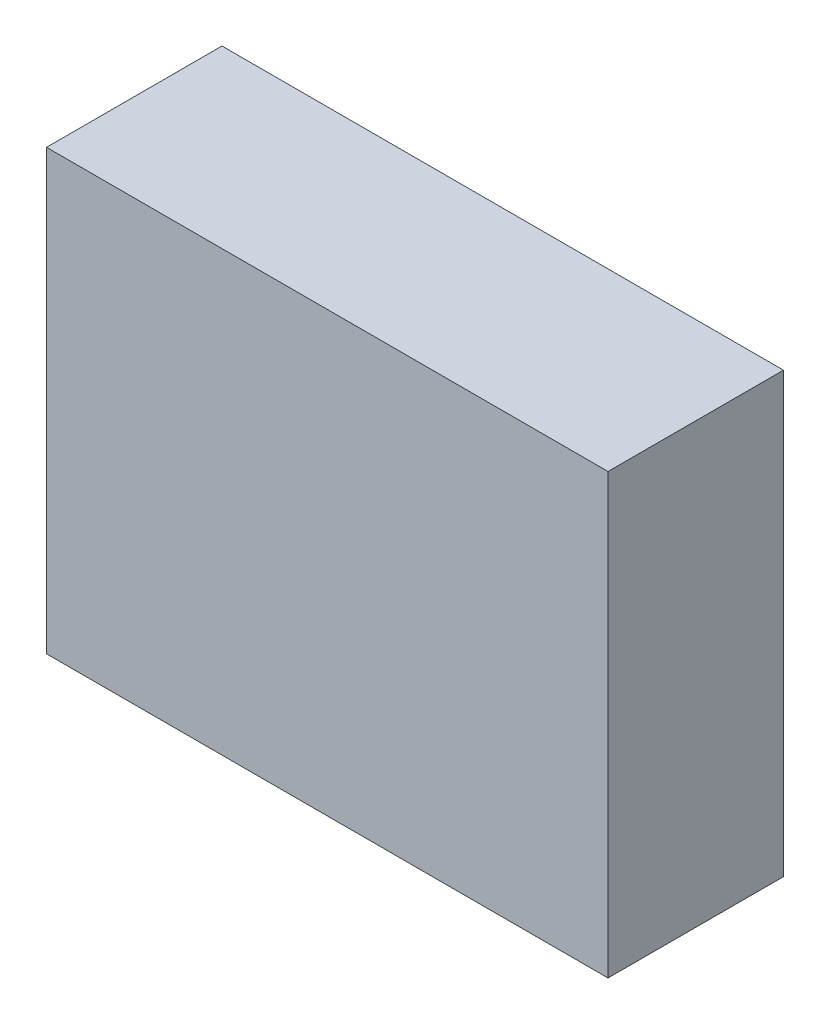
ISO-10303-21;
HEADER;
FILE_DESCRIPTION(('STEP AP214'),'2;1');
FILE_NAME('part.step','',(''),(''),'','','');
FILE_SCHEMA(('AUTOMOTIVE_DESIGN { 1 0 10303 214 1 1 1 1 }'));
ENDSEC;
DATA;
#1=APPLICATION_CONTEXT('core data for automotive mechanical design processes');
#2=APPLICATION_PROTOCOL_DEFINITION('international standard','automotive_design',2000,#1);
#3=PRODUCT_CONTEXT('',#1,'mechanical');
#4=PRODUCT('Part','Part','',(#3));
#5=PRODUCT_RELATED_PRODUCT_CATEGORY('part','',(#4));
#6=PRODUCT_DEFINITION_FORMATION('','',#4);
#7=PRODUCT_DEFINITION_CONTEXT('part definition',#1,'design');
#8=PRODUCT_DEFINITION('design','',#6,#7);
#9=PRODUCT_DEFINITION_SHAPE('','',#8);
#10=(LENGTH_UNIT() NAMED_UNIT(*) SI_UNIT(.MILLI.,.METRE.));
#11=(NAMED_UNIT(*) PLANE_ANGLE_UNIT() SI_UNIT($,.RADIAN.));
#12=(NAMED_UNIT(*) SI_UNIT($,.STERADIAN.) SOLID_ANGLE_UNIT());
#13=UNCERTAINTY_MEASURE_WITH_UNIT(LENGTH_MEASURE(1.E-05),#10,'distance_accuracy_value','');
#14=(GEOMETRIC_REPRESENTATION_CONTEXT(3) GLOBAL_UNCERTAINTY_ASSIGNED_CONTEXT((#13)) GLOBAL_UNIT_ASSIGNED_CONTEXT((#10,
#11,#12)) REPRESENTATION_CONTEXT('',''));
#15=CARTESIAN_POINT('',(0.,0.,0.));
#16=DIRECTION('',(0.,0.,1.));
#17=DIRECTION('',(1.,0.,0.));
#18=AXIS2_PLACEMENT_3D('',#15,#16,#17);
#19=CARTESIAN_POINT('',(1.59999934,1.25000004,1.00000054));
#20=DIRECTION('',(0.,0.,1.));
#21=DIRECTION('',(1.,0.,0.));
#22=AXIS2_PLACEMENT_3D('',#19,#20,#21);
#23=PLANE('',#22);
#24=DIRECTION('',(0.999999999999685,-7.9375035312845E-07,0.));
#25=VECTOR('',#24,1.);
#26=CARTESIAN_POINT('',(1.59999934,-1.25000004,1.00000054));
#27=LINE('',#26,#25);
#28=CARTESIAN_POINT('',(1.59999934,-1.24999877,1.00000054));
#29=VERTEX_POINT('',#28);
#30=CARTESIAN_POINT('',(-1.59999934,-1.24999749999998,1.00000054));
#31=VERTEX_POINT('',#30);
#32=EDGE_CURVE('E53',#29,#31,#27,.F.);
#33=ORIENTED_EDGE('',*,*,#32,.F.);
#34=DIRECTION('',(0.,1.,0.));
#35=VECTOR('',#34,1.);
#36=CARTESIAN_POINT('',(1.59999934,1.25000004,1.00000054));
#37=LINE('',#36,#35);
#38=CARTESIAN_POINT('',(1.59999934,1.25000004,1.00000054));
#39=VERTEX_POINT('',#38);
#40=EDGE_CURVE('E68',#39,#29,#37,.F.);
#41=ORIENTED_EDGE('',*,*,#40,.F.);
#42=DIRECTION('',(1.,0.,0.));
#43=VECTOR('',#42,1.);
#44=CARTESIAN_POINT('',(-1.59999934,1.25000004,1.00000054));
#45=LINE('',#44,#43);
#46=CARTESIAN_POINT('',(-1.59999934,1.25000004,1.00000054));
#47=VERTEX_POINT('',#46);
#48=EDGE_CURVE('E20',#47,#39,#45,.T.);
#49=ORIENTED_EDGE('',*,*,#48,.F.);
#50=DIRECTION('',(0.,1.,0.));
#51=VECTOR('',#50,1.);
#52=CARTESIAN_POINT('',(-1.59999934,-1.2499975,1.00000054));
#53=LINE('',#52,#51);
#54=EDGE_CURVE('E58',#31,#47,#53,.T.);
#55=ORIENTED_EDGE('',*,*,#54,.F.);
#56=EDGE_LOOP('',(#33,#41,#49,#55));
#57=FACE_BOUND('',#56,.T.);
#58=ADVANCED_FACE('F17',(#57),#23,.T.);
#59=CARTESIAN_POINT('',(-1.59999934,1.25000004,0.));
#60=DIRECTION('',(0.,1.,0.));
#61=DIRECTION('',(0.,0.,1.));
#62=AXIS2_PLACEMENT_3D('',#59,#60,#61);
#63=PLANE('',#62);
#64=DIRECTION('',(0.,0.,-1.));
#65=VECTOR('',#64,1.);
#66=CARTESIAN_POINT('',(1.59999934,1.25000004,0.));
#67=LINE('',#66,#65);
#68=CARTESIAN_POINT('',(1.59999934,1.25000004,0.));
#69=VERTEX_POINT('',#68);
#70=EDGE_CURVE('E79',#69,#39,#67,.F.);
#71=ORIENTED_EDGE('',*,*,#70,.F.);
#72=DIRECTION('',(1.,0.,0.));
#73=VECTOR('',#72,1.);
#74=CARTESIAN_POINT('',(1.59999934,1.25000004,0.));
#75=LINE('',#74,#73);
#76=CARTESIAN_POINT('',(-1.59999934,1.25000004,0.));
#77=VERTEX_POINT('',#76);
#78=EDGE_CURVE('E74',#69,#77,#75,.F.);
#79=ORIENTED_EDGE('',*,*,#78,.T.);
#80=DIRECTION('',(0.,0.,1.));
#81=VECTOR('',#80,1.);
#82=CARTESIAN_POINT('',(-1.59999934,1.25000004,0.));
#83=LINE('',#82,#81);
#84=EDGE_CURVE('E63',#47,#77,#83,.F.);
#85=ORIENTED_EDGE('',*,*,#84,.F.);
#86=ORIENTED_EDGE('',*,*,#48,.T.);
#87=EDGE_LOOP('',(#71,#79,#85,#86));
#88=FACE_BOUND('',#87,.T.);
#89=ADVANCED_FACE('F73',(#88),#63,.T.);
#90=CARTESIAN_POINT('',(-1.59999934,-1.2499975,0.));
#91=DIRECTION('',(-1.,0.,0.));
#92=DIRECTION('',(0.,0.,1.));
#93=AXIS2_PLACEMENT_3D('',#90,#91,#92);
#94=PLANE('',#93);
#95=ORIENTED_EDGE('',*,*,#84,.T.);
#96=DIRECTION('',(0.,1.,0.));
#97=VECTOR('',#96,1.);
#98=CARTESIAN_POINT('',(-1.59999934,1.25000004,0.));
#99=LINE('',#98,#97);
#100=CARTESIAN_POINT('',(-1.59999934,-1.24999749999998,0.));
#101=VERTEX_POINT('',#100);
#102=EDGE_CURVE('E84',#77,#101,#99,.F.);
#103=ORIENTED_EDGE('',*,*,#102,.T.);
#104=DIRECTION('',(0.,0.,1.));
#105=VECTOR('',#104,1.);
#106=CARTESIAN_POINT('',(-1.59999934,-1.24999749999992,0.));
#107=LINE('',#106,#105);
#108=EDGE_CURVE('E65',#31,#101,#107,.F.);
#109=ORIENTED_EDGE('',*,*,#108,.F.);
#110=ORIENTED_EDGE('',*,*,#54,.T.);
#111=EDGE_LOOP('',(#95,#103,#109,#110));
#112=FACE_BOUND('',#111,.T.);
#113=ADVANCED_FACE('F60',(#112),#94,.T.);
#114=CARTESIAN_POINT('',(1.59999934,-1.25000004,0.));
#115=DIRECTION('',(-7.9375035312845E-07,-0.999999999999685,0.));
#116=DIRECTION('',(0.999999999999685,-7.9375035312845E-07,0.));
#117=AXIS2_PLACEMENT_3D('',#114,#115,#116);
#118=PLANE('',#117);
#119=ORIENTED_EDGE('',*,*,#108,.T.);
#120=DIRECTION('',(1.,0.,0.));
#121=VECTOR('',#120,1.);
#122=CARTESIAN_POINT('',(1.59999934,-1.2499975,0.));
#123=LINE('',#122,#121);
#124=CARTESIAN_POINT('',(1.59999934,-1.249999405,0.));
#125=VERTEX_POINT('',#124);
#126=EDGE_CURVE('E26',#101,#125,#123,.T.);
#127=ORIENTED_EDGE('',*,*,#126,.T.);
#128=DIRECTION('',(0.,0.,-1.));
#129=VECTOR('',#128,1.);
#130=CARTESIAN_POINT('',(1.59999934,-1.25000004,0.));
#131=LINE('',#130,#129);
#132=EDGE_CURVE('E34',#29,#125,#131,.T.);
#133=ORIENTED_EDGE('',*,*,#132,.F.);
#134=ORIENTED_EDGE('',*,*,#32,.T.);
#135=EDGE_LOOP('',(#119,#127,#133,#134));
#136=FACE_BOUND('',#135,.T.);
#137=ADVANCED_FACE('F88',(#136),#118,.T.);
#138=CARTESIAN_POINT('',(1.59999934,1.25000004,0.));
#139=DIRECTION('',(1.,0.,0.));
#140=DIRECTION('',(0.,0.,-1.));
#141=AXIS2_PLACEMENT_3D('',#138,#139,#140);
#142=PLANE('',#141);
#143=ORIENTED_EDGE('',*,*,#132,.T.);
#144=DIRECTION('',(0.,1.,0.));
#145=VECTOR('',#144,1.);
#146=CARTESIAN_POINT('',(1.59999934,1.25000004,0.));
#147=LINE('',#146,#145);
#148=EDGE_CURVE('E11',#125,#69,#147,.T.);
#149=ORIENTED_EDGE('',*,*,#148,.T.);
#150=ORIENTED_EDGE('',*,*,#70,.T.);
#151=ORIENTED_EDGE('',*,*,#40,.T.);
#152=EDGE_LOOP('',(#143,#149,#150,#151));
#153=FACE_BOUND('',#152,.T.);
#154=ADVANCED_FACE('F91',(#153),#142,.T.);
#155=CARTESIAN_POINT('',(1.59999934,1.25000004,0.));
#156=DIRECTION('',(0.,0.,1.));
#157=DIRECTION('',(1.,0.,0.));
#158=AXIS2_PLACEMENT_3D('',#155,#156,#157);
#159=PLANE('',#158);
#160=ORIENTED_EDGE('',*,*,#126,.F.);
#161=ORIENTED_EDGE('',*,*,#102,.F.);
#162=ORIENTED_EDGE('',*,*,#78,.F.);
#163=ORIENTED_EDGE('',*,*,#148,.F.);
#164=EDGE_LOOP('',(#160,#161,#162,#163));
#165=FACE_BOUND('',#164,.T.);
#166=ADVANCED_FACE('F90',(#165),#159,.F.);
#167=CLOSED_SHELL('',(#58,#89,#113,#137,#154,#166));
#168=MANIFOLD_SOLID_BREP('B1',#167);
#169=ADVANCED_BREP_SHAPE_REPRESENTATION('',(#18,#168),#14);
#170=SHAPE_DEFINITION_REPRESENTATION(#9,#169);
ENDSEC;
END-ISO-10303-21;
